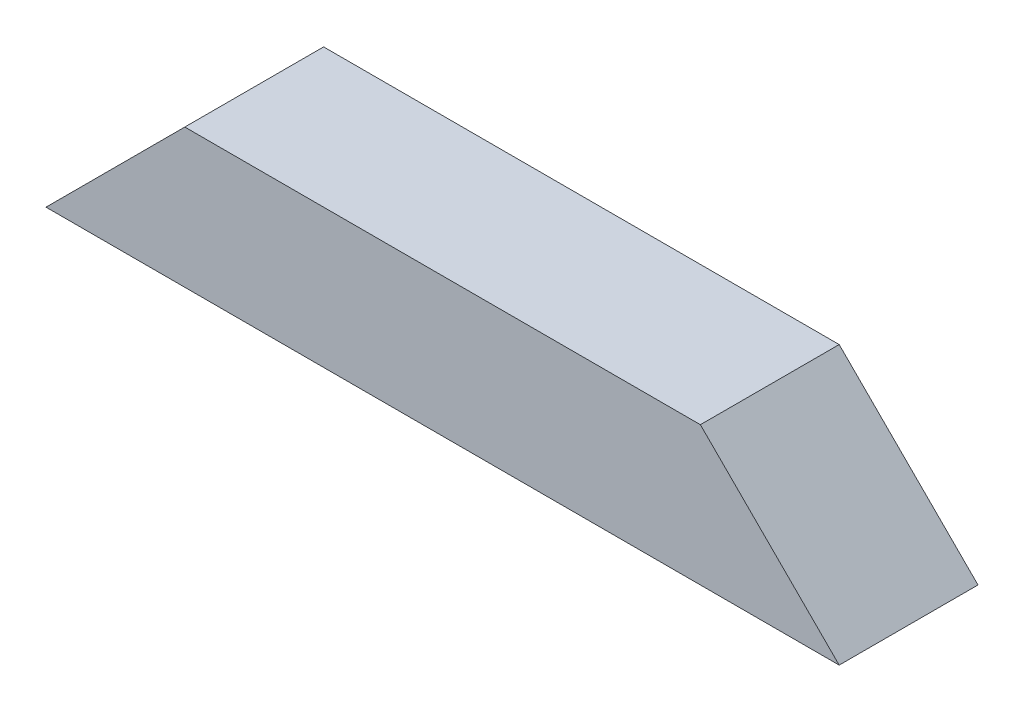
ISO-10303-21;
HEADER;
FILE_DESCRIPTION(('STEP AP214'),'2;1');
FILE_NAME('part.step','',(''),(''),'','','');
FILE_SCHEMA(('AUTOMOTIVE_DESIGN { 1 0 10303 214 1 1 1 1 }'));
ENDSEC;
DATA;
#1=APPLICATION_CONTEXT('core data for automotive mechanical design processes');
#2=APPLICATION_PROTOCOL_DEFINITION('international standard','automotive_design',2000,#1);
#3=PRODUCT_CONTEXT('',#1,'mechanical');
#4=PRODUCT('Part','Part','',(#3));
#5=PRODUCT_RELATED_PRODUCT_CATEGORY('part','',(#4));
#6=PRODUCT_DEFINITION_FORMATION('','',#4);
#7=PRODUCT_DEFINITION_CONTEXT('part definition',#1,'design');
#8=PRODUCT_DEFINITION('design','',#6,#7);
#9=PRODUCT_DEFINITION_SHAPE('','',#8);
#10=(LENGTH_UNIT() NAMED_UNIT(*) SI_UNIT(.MILLI.,.METRE.));
#11=(NAMED_UNIT(*) PLANE_ANGLE_UNIT() SI_UNIT($,.RADIAN.));
#12=(NAMED_UNIT(*) SI_UNIT($,.STERADIAN.) SOLID_ANGLE_UNIT());
#13=UNCERTAINTY_MEASURE_WITH_UNIT(LENGTH_MEASURE(1.E-05),#10,'distance_accuracy_value','');
#14=(GEOMETRIC_REPRESENTATION_CONTEXT(3) GLOBAL_UNCERTAINTY_ASSIGNED_CONTEXT((#13)) GLOBAL_UNIT_ASSIGNED_CONTEXT((#10,
#11,#12)) REPRESENTATION_CONTEXT('',''));
#15=CARTESIAN_POINT('',(0.,0.,0.));
#16=DIRECTION('',(0.,0.,1.));
#17=DIRECTION('',(1.,0.,0.));
#18=AXIS2_PLACEMENT_3D('',#15,#16,#17);
#19=CARTESIAN_POINT('',(0.,0.,-88.9));
#20=DIRECTION('',(0.707106781186546,-0.707106781186549,0.));
#21=DIRECTION('',(0.707106781186549,0.707106781186546,0.));
#22=AXIS2_PLACEMENT_3D('',#19,#20,#21);
#23=PLANE('',#22);
#24=DIRECTION('',(0.707106781186549,0.707106781186546,0.));
#25=VECTOR('',#24,1.);
#26=CARTESIAN_POINT('',(0.,0.,0.));
#27=LINE('',#26,#25);
#28=CARTESIAN_POINT('',(0.,0.,0.));
#29=VERTEX_POINT('',#28);
#30=CARTESIAN_POINT('',(88.9000000000003,88.9,0.));
#31=VERTEX_POINT('',#30);
#32=EDGE_CURVE('E99',#29,#31,#27,.T.);
#33=ORIENTED_EDGE('',*,*,#32,.T.);
#34=DIRECTION('',(0.,0.,1.));
#35=VECTOR('',#34,1.);
#36=CARTESIAN_POINT('',(88.9000000000003,88.9,-88.9));
#37=LINE('',#36,#35);
#38=CARTESIAN_POINT('',(88.9000000000003,88.9,-88.9));
#39=VERTEX_POINT('',#38);
#40=EDGE_CURVE('E11',#39,#31,#37,.T.);
#41=ORIENTED_EDGE('',*,*,#40,.F.);
#42=DIRECTION('',(0.707106781186549,0.707106781186546,0.));
#43=VECTOR('',#42,1.);
#44=CARTESIAN_POINT('',(0.,0.,-88.9));
#45=LINE('',#44,#43);
#46=CARTESIAN_POINT('',(0.,0.,-88.9));
#47=VERTEX_POINT('',#46);
#48=EDGE_CURVE('E94',#47,#39,#45,.T.);
#49=ORIENTED_EDGE('',*,*,#48,.F.);
#50=DIRECTION('',(0.,0.,1.));
#51=VECTOR('',#50,1.);
#52=CARTESIAN_POINT('',(0.,0.,-88.9));
#53=LINE('',#52,#51);
#54=EDGE_CURVE('E38',#47,#29,#53,.T.);
#55=ORIENTED_EDGE('',*,*,#54,.T.);
#56=EDGE_LOOP('',(#33,#41,#49,#55));
#57=FACE_BOUND('',#56,.T.);
#58=ADVANCED_FACE('F35',(#57),#23,.F.);
#59=CARTESIAN_POINT('',(0.,88.9,-88.9));
#60=DIRECTION('',(0.,-1.,0.));
#61=DIRECTION('',(0.,0.,-1.));
#62=AXIS2_PLACEMENT_3D('',#59,#60,#61);
#63=PLANE('',#62);
#64=DIRECTION('',(1.,0.,0.));
#65=VECTOR('',#64,1.);
#66=CARTESIAN_POINT('',(0.,88.9,0.));
#67=LINE('',#66,#65);
#68=CARTESIAN_POINT('',(419.1,88.9,0.));
#69=VERTEX_POINT('',#68);
#70=EDGE_CURVE('E74',#31,#69,#67,.T.);
#71=ORIENTED_EDGE('',*,*,#70,.T.);
#72=DIRECTION('',(0.,0.,1.));
#73=VECTOR('',#72,1.);
#74=CARTESIAN_POINT('',(419.1,88.9,-88.9));
#75=LINE('',#74,#73);
#76=CARTESIAN_POINT('',(419.1,88.9,-88.9));
#77=VERTEX_POINT('',#76);
#78=EDGE_CURVE('E44',#77,#69,#75,.T.);
#79=ORIENTED_EDGE('',*,*,#78,.F.);
#80=DIRECTION('',(1.,0.,0.));
#81=VECTOR('',#80,1.);
#82=CARTESIAN_POINT('',(0.,88.9,-88.9));
#83=LINE('',#82,#81);
#84=EDGE_CURVE('E52',#39,#77,#83,.T.);
#85=ORIENTED_EDGE('',*,*,#84,.F.);
#86=ORIENTED_EDGE('',*,*,#40,.T.);
#87=EDGE_LOOP('',(#71,#79,#85,#86));
#88=FACE_BOUND('',#87,.T.);
#89=ADVANCED_FACE('F106',(#88),#63,.F.);
#90=CARTESIAN_POINT('',(253.999999999999,254.,-88.9));
#91=DIRECTION('',(0.707106781186546,0.707106781186549,0.));
#92=DIRECTION('',(-0.707106781186549,0.707106781186546,0.));
#93=AXIS2_PLACEMENT_3D('',#90,#91,#92);
#94=PLANE('',#93);
#95=DIRECTION('',(-0.707106781186549,0.707106781186546,0.));
#96=VECTOR('',#95,1.);
#97=CARTESIAN_POINT('',(253.999999999999,254.,0.));
#98=LINE('',#97,#96);
#99=CARTESIAN_POINT('',(508.,0.,0.));
#100=VERTEX_POINT('',#99);
#101=EDGE_CURVE('E86',#100,#69,#98,.T.);
#102=ORIENTED_EDGE('',*,*,#101,.F.);
#103=DIRECTION('',(0.,0.,1.));
#104=VECTOR('',#103,1.);
#105=CARTESIAN_POINT('',(508.,0.,-88.9));
#106=LINE('',#105,#104);
#107=CARTESIAN_POINT('',(508.,0.,-88.9));
#108=VERTEX_POINT('',#107);
#109=EDGE_CURVE('E82',#108,#100,#106,.T.);
#110=ORIENTED_EDGE('',*,*,#109,.F.);
#111=DIRECTION('',(-0.707106781186549,0.707106781186546,0.));
#112=VECTOR('',#111,1.);
#113=CARTESIAN_POINT('',(253.999999999999,254.,-88.9));
#114=LINE('',#113,#112);
#115=EDGE_CURVE('E85',#108,#77,#114,.T.);
#116=ORIENTED_EDGE('',*,*,#115,.T.);
#117=ORIENTED_EDGE('',*,*,#78,.T.);
#118=EDGE_LOOP('',(#102,#110,#116,#117));
#119=FACE_BOUND('',#118,.T.);
#120=ADVANCED_FACE('F84',(#119),#94,.T.);
#121=CARTESIAN_POINT('',(0.,0.,-88.9));
#122=DIRECTION('',(0.,-1.,0.));
#123=DIRECTION('',(0.,0.,-1.));
#124=AXIS2_PLACEMENT_3D('',#121,#122,#123);
#125=PLANE('',#124);
#126=DIRECTION('',(1.,0.,0.));
#127=VECTOR('',#126,1.);
#128=CARTESIAN_POINT('',(0.,0.,0.));
#129=LINE('',#128,#127);
#130=EDGE_CURVE('E102',#29,#100,#129,.T.);
#131=ORIENTED_EDGE('',*,*,#130,.F.);
#132=ORIENTED_EDGE('',*,*,#54,.F.);
#133=DIRECTION('',(1.,0.,0.));
#134=VECTOR('',#133,1.);
#135=CARTESIAN_POINT('',(0.,0.,-88.9));
#136=LINE('',#135,#134);
#137=EDGE_CURVE('E91',#47,#108,#136,.T.);
#138=ORIENTED_EDGE('',*,*,#137,.T.);
#139=ORIENTED_EDGE('',*,*,#109,.T.);
#140=EDGE_LOOP('',(#131,#132,#138,#139));
#141=FACE_BOUND('',#140,.T.);
#142=ADVANCED_FACE('F93',(#141),#125,.T.);
#143=CARTESIAN_POINT('',(0.,0.,-88.9));
#144=DIRECTION('',(0.,0.,1.));
#145=DIRECTION('',(1.,0.,0.));
#146=AXIS2_PLACEMENT_3D('',#143,#144,#145);
#147=PLANE('',#146);
#148=ORIENTED_EDGE('',*,*,#48,.T.);
#149=ORIENTED_EDGE('',*,*,#84,.T.);
#150=ORIENTED_EDGE('',*,*,#115,.F.);
#151=ORIENTED_EDGE('',*,*,#137,.F.);
#152=EDGE_LOOP('',(#148,#149,#150,#151));
#153=FACE_BOUND('',#152,.T.);
#154=ADVANCED_FACE('F90',(#153),#147,.F.);
#155=CARTESIAN_POINT('',(0.,0.,0.));
#156=DIRECTION('',(0.,0.,1.));
#157=DIRECTION('',(1.,0.,0.));
#158=AXIS2_PLACEMENT_3D('',#155,#156,#157);
#159=PLANE('',#158);
#160=ORIENTED_EDGE('',*,*,#32,.F.);
#161=ORIENTED_EDGE('',*,*,#130,.T.);
#162=ORIENTED_EDGE('',*,*,#101,.T.);
#163=ORIENTED_EDGE('',*,*,#70,.F.);
#164=EDGE_LOOP('',(#160,#161,#162,#163));
#165=FACE_BOUND('',#164,.T.);
#166=ADVANCED_FACE('F108',(#165),#159,.T.);
#167=CLOSED_SHELL('',(#58,#89,#120,#142,#154,#166));
#168=MANIFOLD_SOLID_BREP('B2',#167);
#169=ADVANCED_BREP_SHAPE_REPRESENTATION('',(#18,#168),#14);
#170=SHAPE_DEFINITION_REPRESENTATION(#9,#169);
ENDSEC;
END-ISO-10303-21;
